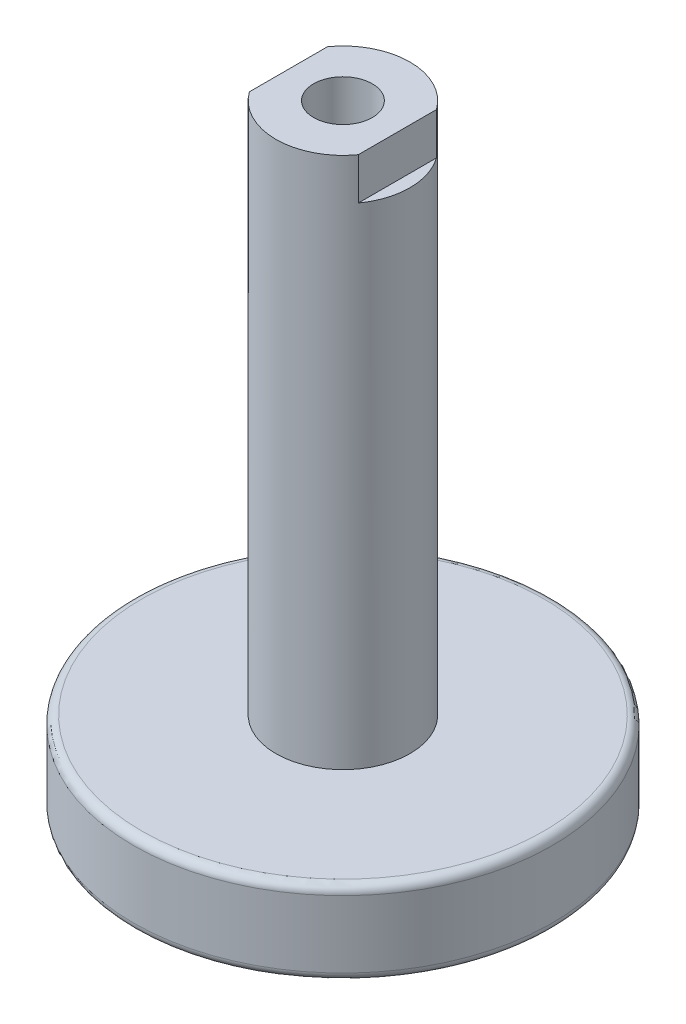
ISO-10303-21;
HEADER;
FILE_DESCRIPTION(('STEP AP214'),'2;1');
FILE_NAME('part.step','',(''),(''),'','','');
FILE_SCHEMA(('AUTOMOTIVE_DESIGN { 1 0 10303 214 1 1 1 1 }'));
ENDSEC;
DATA;
#1=APPLICATION_CONTEXT('core data for automotive mechanical design processes');
#2=APPLICATION_PROTOCOL_DEFINITION('international standard','automotive_design',2000,#1);
#3=PRODUCT_CONTEXT('',#1,'mechanical');
#4=PRODUCT('Part','Part','',(#3));
#5=PRODUCT_RELATED_PRODUCT_CATEGORY('part','',(#4));
#6=PRODUCT_DEFINITION_FORMATION('','',#4);
#7=PRODUCT_DEFINITION_CONTEXT('part definition',#1,'design');
#8=PRODUCT_DEFINITION('design','',#6,#7);
#9=PRODUCT_DEFINITION_SHAPE('','',#8);
#10=(LENGTH_UNIT() NAMED_UNIT(*) SI_UNIT(.MILLI.,.METRE.));
#11=(NAMED_UNIT(*) PLANE_ANGLE_UNIT() SI_UNIT($,.RADIAN.));
#12=(NAMED_UNIT(*) SI_UNIT($,.STERADIAN.) SOLID_ANGLE_UNIT());
#13=UNCERTAINTY_MEASURE_WITH_UNIT(LENGTH_MEASURE(1.E-05),#10,'distance_accuracy_value','');
#14=(GEOMETRIC_REPRESENTATION_CONTEXT(3) GLOBAL_UNCERTAINTY_ASSIGNED_CONTEXT((#13)) GLOBAL_UNIT_ASSIGNED_CONTEXT((#10,
#11,#12)) REPRESENTATION_CONTEXT('',''));
#15=CARTESIAN_POINT('',(0.,0.,0.));
#16=DIRECTION('',(0.,0.,1.));
#17=DIRECTION('',(1.,0.,0.));
#18=AXIS2_PLACEMENT_3D('',#15,#16,#17);
#19=CARTESIAN_POINT('',(0.,73.5,0.));
#20=DIRECTION('',(0.,-1.,0.));
#21=DIRECTION('',(0.,0.,-1.));
#22=AXIS2_PLACEMENT_3D('',#19,#20,#21);
#23=CYLINDRICAL_SURFACE('',#22,8.);
#24=CARTESIAN_POINT('',(0.,10.,0.));
#25=DIRECTION('',(0.,1.,0.));
#26=DIRECTION('',(0.,0.,1.));
#27=AXIS2_PLACEMENT_3D('',#24,#25,#26);
#28=CIRCLE('',#27,8.);
#29=CARTESIAN_POINT('',(0.,10.,8.));
#30=VERTEX_POINT('',#29);
#31=EDGE_CURVE('E102',#30,#30,#28,.T.);
#32=ORIENTED_EDGE('',*,*,#31,.T.);
#33=EDGE_LOOP('',(#32));
#34=FACE_BOUND('',#33,.T.);
#35=DIRECTION('',(0.,-1.,0.));
#36=VECTOR('',#35,1.);
#37=CARTESIAN_POINT('',(6.5,73.5,4.66368952654441));
#38=LINE('',#37,#36);
#39=CARTESIAN_POINT('',(6.5,73.5,4.66368952654441));
#40=VERTEX_POINT('',#39);
#41=CARTESIAN_POINT('',(6.5,68.5,4.66368952654441));
#42=VERTEX_POINT('',#41);
#43=EDGE_CURVE('E124',#40,#42,#38,.T.);
#44=ORIENTED_EDGE('',*,*,#43,.F.);
#45=CARTESIAN_POINT('',(0.,73.5,0.));
#46=DIRECTION('',(0.,1.,0.));
#47=DIRECTION('',(0.,0.,1.));
#48=AXIS2_PLACEMENT_3D('',#45,#46,#47);
#49=CIRCLE('',#48,8.);
#50=CARTESIAN_POINT('',(-6.5,73.5,4.6636895265444));
#51=VERTEX_POINT('',#50);
#52=EDGE_CURVE('E97',#51,#40,#49,.T.);
#53=ORIENTED_EDGE('',*,*,#52,.F.);
#54=DIRECTION('',(0.,-1.,0.));
#55=VECTOR('',#54,1.);
#56=CARTESIAN_POINT('',(-6.5,73.5,4.6636895265444));
#57=LINE('',#56,#55);
#58=CARTESIAN_POINT('',(-6.5,68.5,4.6636895265444));
#59=VERTEX_POINT('',#58);
#60=EDGE_CURVE('E50',#59,#51,#57,.F.);
#61=ORIENTED_EDGE('',*,*,#60,.F.);
#62=CARTESIAN_POINT('',(0.,68.5,0.));
#63=DIRECTION('',(0.,1.,0.));
#64=DIRECTION('',(0.,0.,1.));
#65=AXIS2_PLACEMENT_3D('',#62,#63,#64);
#66=CIRCLE('',#65,8.);
#67=CARTESIAN_POINT('',(-6.5,68.5,-4.6636895265444));
#68=VERTEX_POINT('',#67);
#69=EDGE_CURVE('E39',#68,#59,#66,.T.);
#70=ORIENTED_EDGE('',*,*,#69,.F.);
#71=DIRECTION('',(0.,-1.,0.));
#72=VECTOR('',#71,1.);
#73=CARTESIAN_POINT('',(-6.5,73.5,-4.6636895265444));
#74=LINE('',#73,#72);
#75=CARTESIAN_POINT('',(-6.5,73.5,-4.6636895265444));
#76=VERTEX_POINT('',#75);
#77=EDGE_CURVE('E80',#76,#68,#74,.T.);
#78=ORIENTED_EDGE('',*,*,#77,.F.);
#79=CARTESIAN_POINT('',(6.5,73.5,-4.66368952654441));
#80=VERTEX_POINT('',#79);
#81=EDGE_CURVE('E93',#80,#76,#49,.T.);
#82=ORIENTED_EDGE('',*,*,#81,.F.);
#83=DIRECTION('',(0.,-1.,0.));
#84=VECTOR('',#83,1.);
#85=CARTESIAN_POINT('',(6.5,73.5,-4.66368952654441));
#86=LINE('',#85,#84);
#87=CARTESIAN_POINT('',(6.5,68.5,-4.66368952654441));
#88=VERTEX_POINT('',#87);
#89=EDGE_CURVE('E58',#88,#80,#86,.F.);
#90=ORIENTED_EDGE('',*,*,#89,.F.);
#91=EDGE_CURVE('E12',#42,#88,#66,.T.);
#92=ORIENTED_EDGE('',*,*,#91,.F.);
#93=EDGE_LOOP('',(#44,#53,#61,#70,#78,#82,#90,#92));
#94=FACE_BOUND('',#93,.T.);
#95=ADVANCED_FACE('F35',(#34,#94),#23,.T.);
#96=CARTESIAN_POINT('',(0.,73.5,0.));
#97=DIRECTION('',(0.,1.,0.));
#98=DIRECTION('',(0.,0.,1.));
#99=AXIS2_PLACEMENT_3D('',#96,#97,#98);
#100=PLANE('',#99);
#101=CARTESIAN_POINT('',(0.,73.5,0.));
#102=DIRECTION('',(0.,1.,0.));
#103=DIRECTION('',(0.,0.,1.));
#104=AXIS2_PLACEMENT_3D('',#101,#102,#103);
#105=CIRCLE('',#104,3.5);
#106=CARTESIAN_POINT('',(0.,73.5,3.5));
#107=VERTEX_POINT('',#106);
#108=EDGE_CURVE('E125',#107,#107,#105,.T.);
#109=ORIENTED_EDGE('',*,*,#108,.F.);
#110=EDGE_LOOP('',(#109));
#111=FACE_BOUND('',#110,.T.);
#112=ORIENTED_EDGE('',*,*,#52,.T.);
#113=DIRECTION('',(0.,0.,-1.));
#114=VECTOR('',#113,1.);
#115=CARTESIAN_POINT('',(6.5,73.5,0.));
#116=LINE('',#115,#114);
#117=EDGE_CURVE('E86',#40,#80,#116,.T.);
#118=ORIENTED_EDGE('',*,*,#117,.T.);
#119=ORIENTED_EDGE('',*,*,#81,.T.);
#120=DIRECTION('',(0.,0.,1.));
#121=VECTOR('',#120,1.);
#122=CARTESIAN_POINT('',(-6.5,73.5,0.));
#123=LINE('',#122,#121);
#124=EDGE_CURVE('E77',#76,#51,#123,.T.);
#125=ORIENTED_EDGE('',*,*,#124,.T.);
#126=EDGE_LOOP('',(#112,#118,#119,#125));
#127=FACE_BOUND('',#126,.T.);
#128=ADVANCED_FACE('F95',(#111,#127),#100,.T.);
#129=CARTESIAN_POINT('',(0.,10.,0.));
#130=DIRECTION('',(0.,1.,0.));
#131=DIRECTION('',(0.,0.,1.));
#132=AXIS2_PLACEMENT_3D('',#129,#130,#131);
#133=PLANE('',#132);
#134=CARTESIAN_POINT('',(0.,10.,0.));
#135=DIRECTION('',(0.,1.,0.));
#136=DIRECTION('',(0.,0.,1.));
#137=AXIS2_PLACEMENT_3D('',#134,#135,#136);
#138=CIRCLE('',#137,24.);
#139=CARTESIAN_POINT('',(0.,10.,24.));
#140=VERTEX_POINT('',#139);
#141=EDGE_CURVE('E87',#140,#140,#138,.T.);
#142=ORIENTED_EDGE('',*,*,#141,.T.);
#143=EDGE_LOOP('',(#142));
#144=FACE_BOUND('',#143,.T.);
#145=ORIENTED_EDGE('',*,*,#31,.F.);
#146=EDGE_LOOP('',(#145));
#147=FACE_BOUND('',#146,.T.);
#148=ADVANCED_FACE('F151',(#144,#147),#133,.T.);
#149=CARTESIAN_POINT('',(0.,10.,0.));
#150=DIRECTION('',(0.,-1.,0.));
#151=DIRECTION('',(0.,0.,-1.));
#152=AXIS2_PLACEMENT_3D('',#149,#150,#151);
#153=CYLINDRICAL_SURFACE('',#152,25.);
#154=CARTESIAN_POINT('',(0.,0.999999999999999,0.));
#155=DIRECTION('',(0.,1.,0.));
#156=DIRECTION('',(0.,0.,1.));
#157=AXIS2_PLACEMENT_3D('',#154,#155,#156);
#158=CIRCLE('',#157,25.);
#159=CARTESIAN_POINT('',(0.,0.999999999999999,25.));
#160=VERTEX_POINT('',#159);
#161=EDGE_CURVE('E100',#160,#160,#158,.T.);
#162=ORIENTED_EDGE('',*,*,#161,.T.);
#163=EDGE_LOOP('',(#162));
#164=FACE_BOUND('',#163,.T.);
#165=CARTESIAN_POINT('',(0.,9.,0.));
#166=DIRECTION('',(0.,1.,0.));
#167=DIRECTION('',(0.,0.,1.));
#168=AXIS2_PLACEMENT_3D('',#165,#166,#167);
#169=CIRCLE('',#168,25.);
#170=CARTESIAN_POINT('',(0.,9.,25.));
#171=VERTEX_POINT('',#170);
#172=EDGE_CURVE('E96',#171,#171,#169,.F.);
#173=ORIENTED_EDGE('',*,*,#172,.T.);
#174=EDGE_LOOP('',(#173));
#175=FACE_BOUND('',#174,.T.);
#176=ADVANCED_FACE('F157',(#164,#175),#153,.T.);
#177=CARTESIAN_POINT('',(0.,0.,0.));
#178=DIRECTION('',(0.,1.,0.));
#179=DIRECTION('',(0.,0.,1.));
#180=AXIS2_PLACEMENT_3D('',#177,#178,#179);
#181=PLANE('',#180);
#182=CARTESIAN_POINT('',(0.,0.,0.));
#183=DIRECTION('',(0.,1.,0.));
#184=DIRECTION('',(0.,0.,1.));
#185=AXIS2_PLACEMENT_3D('',#182,#183,#184);
#186=CIRCLE('',#185,24.);
#187=CARTESIAN_POINT('',(0.,0.,24.));
#188=VERTEX_POINT('',#187);
#189=EDGE_CURVE('E111',#188,#188,#186,.F.);
#190=ORIENTED_EDGE('',*,*,#189,.T.);
#191=EDGE_LOOP('',(#190));
#192=FACE_BOUND('',#191,.T.);
#193=ADVANCED_FACE('F159',(#192),#181,.F.);
#194=CARTESIAN_POINT('',(0.,0.999999999999999,0.));
#195=DIRECTION('',(0.,1.,0.));
#196=DIRECTION('',(0.,0.,1.));
#197=AXIS2_PLACEMENT_3D('',#194,#195,#196);
#198=TOROIDAL_SURFACE('',#197,24.,1.);
#199=ORIENTED_EDGE('',*,*,#189,.F.);
#200=EDGE_LOOP('',(#199));
#201=FACE_BOUND('',#200,.T.);
#202=ORIENTED_EDGE('',*,*,#161,.F.);
#203=EDGE_LOOP('',(#202));
#204=FACE_BOUND('',#203,.T.);
#205=ADVANCED_FACE('F162',(#201,#204),#198,.T.);
#206=CARTESIAN_POINT('',(0.,9.,0.));
#207=DIRECTION('',(0.,1.,0.));
#208=DIRECTION('',(0.,0.,1.));
#209=AXIS2_PLACEMENT_3D('',#206,#207,#208);
#210=TOROIDAL_SURFACE('',#209,24.,1.);
#211=ORIENTED_EDGE('',*,*,#172,.F.);
#212=EDGE_LOOP('',(#211));
#213=FACE_BOUND('',#212,.T.);
#214=ORIENTED_EDGE('',*,*,#141,.F.);
#215=EDGE_LOOP('',(#214));
#216=FACE_BOUND('',#215,.T.);
#217=ADVANCED_FACE('F37',(#213,#216),#210,.T.);
#218=CARTESIAN_POINT('',(0.,61.5,0.));
#219=DIRECTION('',(0.,1.,0.));
#220=DIRECTION('',(0.,0.,1.));
#221=AXIS2_PLACEMENT_3D('',#218,#219,#220);
#222=CONICAL_SURFACE('',#221,3.5,1.02974425867665);
#223=CARTESIAN_POINT('',(0.,59.3969878334035,0.));
#224=VERTEX_POINT('',#223);
#225=VERTEX_LOOP('',#224);
#226=FACE_BOUND('',#225,.T.);
#227=CARTESIAN_POINT('',(0.,61.5,0.));
#228=DIRECTION('',(0.,1.,0.));
#229=DIRECTION('',(0.,0.,1.));
#230=AXIS2_PLACEMENT_3D('',#227,#228,#229);
#231=CIRCLE('',#230,3.5);
#232=CARTESIAN_POINT('',(0.,61.5,3.5));
#233=VERTEX_POINT('',#232);
#234=EDGE_CURVE('E105',#233,#233,#231,.T.);
#235=ORIENTED_EDGE('',*,*,#234,.T.);
#236=EDGE_LOOP('',(#235));
#237=FACE_BOUND('',#236,.T.);
#238=ADVANCED_FACE('F132',(#226,#237),#222,.F.);
#239=CARTESIAN_POINT('',(0.,73.5,0.));
#240=DIRECTION('',(0.,1.,0.));
#241=DIRECTION('',(0.,0.,1.));
#242=AXIS2_PLACEMENT_3D('',#239,#240,#241);
#243=CYLINDRICAL_SURFACE('',#242,3.5);
#244=ORIENTED_EDGE('',*,*,#234,.F.);
#245=EDGE_LOOP('',(#244));
#246=FACE_BOUND('',#245,.T.);
#247=ORIENTED_EDGE('',*,*,#108,.T.);
#248=EDGE_LOOP('',(#247));
#249=FACE_BOUND('',#248,.T.);
#250=ADVANCED_FACE('F134',(#246,#249),#243,.F.);
#251=CARTESIAN_POINT('',(-6.5,68.5,-9.07240230022119));
#252=DIRECTION('',(-1.,0.,0.));
#253=DIRECTION('',(0.,0.,1.));
#254=AXIS2_PLACEMENT_3D('',#251,#252,#253);
#255=PLANE('',#254);
#256=ORIENTED_EDGE('',*,*,#77,.T.);
#257=DIRECTION('',(0.,0.,1.));
#258=VECTOR('',#257,1.);
#259=CARTESIAN_POINT('',(-6.5,68.5,-9.07240230022119));
#260=LINE('',#259,#258);
#261=EDGE_CURVE('E117',#68,#59,#260,.T.);
#262=ORIENTED_EDGE('',*,*,#261,.T.);
#263=ORIENTED_EDGE('',*,*,#60,.T.);
#264=ORIENTED_EDGE('',*,*,#124,.F.);
#265=EDGE_LOOP('',(#256,#262,#263,#264));
#266=FACE_BOUND('',#265,.T.);
#267=ADVANCED_FACE('F79',(#266),#255,.T.);
#268=CARTESIAN_POINT('',(0.,68.5,0.));
#269=DIRECTION('',(0.,1.,0.));
#270=DIRECTION('',(0.,0.,1.));
#271=AXIS2_PLACEMENT_3D('',#268,#269,#270);
#272=PLANE('',#271);
#273=ORIENTED_EDGE('',*,*,#69,.T.);
#274=ORIENTED_EDGE('',*,*,#261,.F.);
#275=EDGE_LOOP('',(#273,#274));
#276=FACE_BOUND('',#275,.T.);
#277=ADVANCED_FACE('F116',(#276),#272,.T.);
#278=ORIENTED_EDGE('',*,*,#91,.T.);
#279=DIRECTION('',(0.,0.,-1.));
#280=VECTOR('',#279,1.);
#281=CARTESIAN_POINT('',(6.5,68.5,-9.07240230022119));
#282=LINE('',#281,#280);
#283=EDGE_CURVE('E118',#42,#88,#282,.T.);
#284=ORIENTED_EDGE('',*,*,#283,.F.);
#285=EDGE_LOOP('',(#278,#284));
#286=FACE_BOUND('',#285,.T.);
#287=ADVANCED_FACE('F219',(#286),#272,.T.);
#288=CARTESIAN_POINT('',(6.5,68.5,-9.07240230022119));
#289=DIRECTION('',(1.,0.,0.));
#290=DIRECTION('',(0.,0.,-1.));
#291=AXIS2_PLACEMENT_3D('',#288,#289,#290);
#292=PLANE('',#291);
#293=ORIENTED_EDGE('',*,*,#43,.T.);
#294=ORIENTED_EDGE('',*,*,#283,.T.);
#295=ORIENTED_EDGE('',*,*,#89,.T.);
#296=ORIENTED_EDGE('',*,*,#117,.F.);
#297=EDGE_LOOP('',(#293,#294,#295,#296));
#298=FACE_BOUND('',#297,.T.);
#299=ADVANCED_FACE('F227',(#298),#292,.T.);
#300=CLOSED_SHELL('',(#95,#128,#148,#176,#193,#205,#217,#238,#250,#267,#277,#287,#299));
#301=MANIFOLD_SOLID_BREP('B2',#300);
#302=ADVANCED_BREP_SHAPE_REPRESENTATION('',(#18,#301),#14);
#303=SHAPE_DEFINITION_REPRESENTATION(#9,#302);
ENDSEC;
END-ISO-10303-21;
